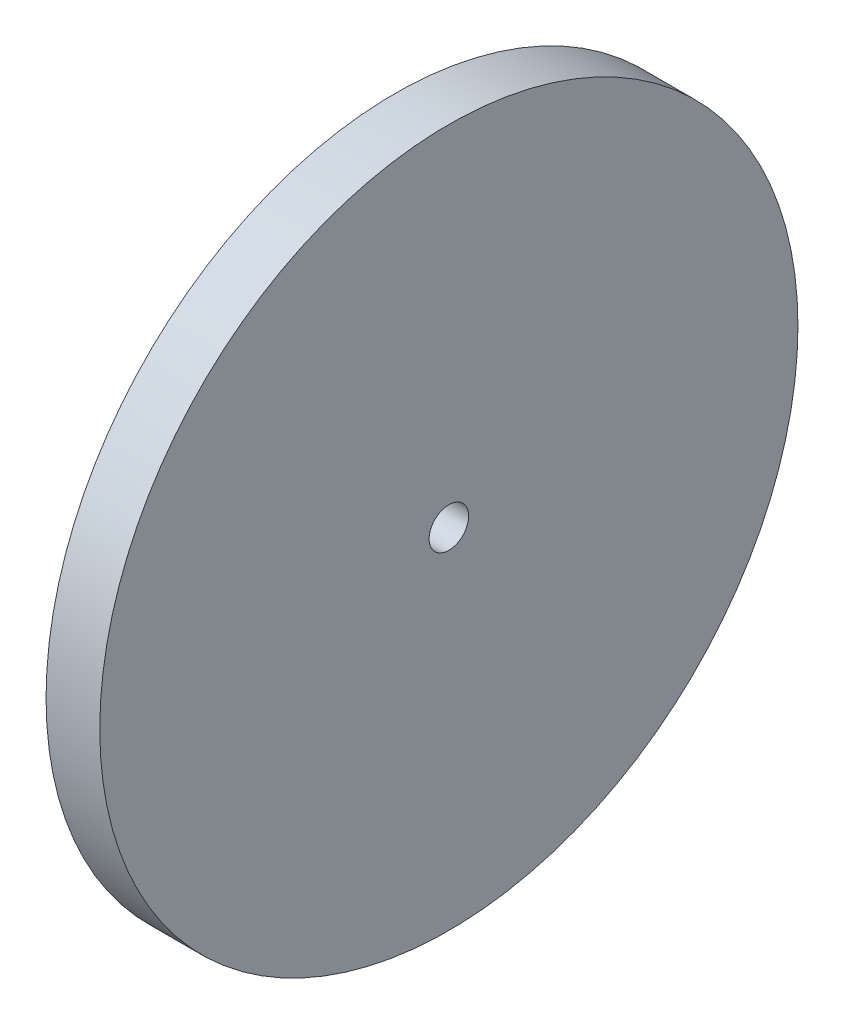
ISO-10303-21;
HEADER;
FILE_DESCRIPTION(('STEP AP214'),'2;1');
FILE_NAME('part.step','',(''),(''),'','','');
FILE_SCHEMA(('AUTOMOTIVE_DESIGN { 1 0 10303 214 1 1 1 1 }'));
ENDSEC;
DATA;
#1=APPLICATION_CONTEXT('core data for automotive mechanical design processes');
#2=APPLICATION_PROTOCOL_DEFINITION('international standard','automotive_design',2000,#1);
#3=PRODUCT_CONTEXT('',#1,'mechanical');
#4=PRODUCT('Part','Part','',(#3));
#5=PRODUCT_RELATED_PRODUCT_CATEGORY('part','',(#4));
#6=PRODUCT_DEFINITION_FORMATION('','',#4);
#7=PRODUCT_DEFINITION_CONTEXT('part definition',#1,'design');
#8=PRODUCT_DEFINITION('design','',#6,#7);
#9=PRODUCT_DEFINITION_SHAPE('','',#8);
#10=(LENGTH_UNIT() NAMED_UNIT(*) SI_UNIT(.MILLI.,.METRE.));
#11=(NAMED_UNIT(*) PLANE_ANGLE_UNIT() SI_UNIT($,.RADIAN.));
#12=(NAMED_UNIT(*) SI_UNIT($,.STERADIAN.) SOLID_ANGLE_UNIT());
#13=UNCERTAINTY_MEASURE_WITH_UNIT(LENGTH_MEASURE(1.E-05),#10,'distance_accuracy_value','');
#14=(GEOMETRIC_REPRESENTATION_CONTEXT(3) GLOBAL_UNCERTAINTY_ASSIGNED_CONTEXT((#13)) GLOBAL_UNIT_ASSIGNED_CONTEXT((#10,
#11,#12)) REPRESENTATION_CONTEXT('',''));
#15=CARTESIAN_POINT('',(0.,0.,0.));
#16=DIRECTION('',(0.,0.,1.));
#17=DIRECTION('',(1.,0.,0.));
#18=AXIS2_PLACEMENT_3D('',#15,#16,#17);
#19=CARTESIAN_POINT('',(10.,0.,0.));
#20=DIRECTION('',(1.,0.,0.));
#21=DIRECTION('',(0.,0.,-1.));
#22=AXIS2_PLACEMENT_3D('',#19,#20,#21);
#23=PLANE('',#22);
#24=CARTESIAN_POINT('',(10.,0.,0.));
#25=DIRECTION('',(1.,0.,0.));
#26=DIRECTION('',(0.,0.,-1.));
#27=AXIS2_PLACEMENT_3D('',#24,#25,#26);
#28=CIRCLE('',#27,65.);
#29=CARTESIAN_POINT('',(10.,0.,-65.));
#30=VERTEX_POINT('',#29);
#31=EDGE_CURVE('E10',#30,#30,#28,.T.);
#32=ORIENTED_EDGE('',*,*,#31,.T.);
#33=EDGE_LOOP('',(#32));
#34=FACE_BOUND('',#33,.T.);
#35=CARTESIAN_POINT('',(10.,0.,0.));
#36=DIRECTION('',(1.,0.,0.));
#37=DIRECTION('',(0.,0.,-1.));
#38=AXIS2_PLACEMENT_3D('',#35,#36,#37);
#39=CIRCLE('',#38,3.675);
#40=CARTESIAN_POINT('',(10.,0.,-3.675));
#41=VERTEX_POINT('',#40);
#42=EDGE_CURVE('E56',#41,#41,#39,.T.);
#43=ORIENTED_EDGE('',*,*,#42,.F.);
#44=EDGE_LOOP('',(#43));
#45=FACE_BOUND('',#44,.T.);
#46=ADVANCED_FACE('F43',(#34,#45),#23,.T.);
#47=CARTESIAN_POINT('',(0.,0.,0.));
#48=DIRECTION('',(1.,0.,0.));
#49=DIRECTION('',(0.,0.,-1.));
#50=AXIS2_PLACEMENT_3D('',#47,#48,#49);
#51=PLANE('',#50);
#52=CARTESIAN_POINT('',(0.,0.,0.));
#53=DIRECTION('',(1.,0.,0.));
#54=DIRECTION('',(0.,0.,-1.));
#55=AXIS2_PLACEMENT_3D('',#52,#53,#54);
#56=CIRCLE('',#55,65.);
#57=CARTESIAN_POINT('',(0.,0.,-65.));
#58=VERTEX_POINT('',#57);
#59=EDGE_CURVE('E47',#58,#58,#56,.T.);
#60=ORIENTED_EDGE('',*,*,#59,.F.);
#61=EDGE_LOOP('',(#60));
#62=FACE_BOUND('',#61,.T.);
#63=CARTESIAN_POINT('',(0.,0.,0.));
#64=DIRECTION('',(1.,0.,0.));
#65=DIRECTION('',(0.,0.,-1.));
#66=AXIS2_PLACEMENT_3D('',#63,#64,#65);
#67=CIRCLE('',#66,3.675);
#68=CARTESIAN_POINT('',(0.,0.,-3.675));
#69=VERTEX_POINT('',#68);
#70=EDGE_CURVE('E58',#69,#69,#67,.T.);
#71=ORIENTED_EDGE('',*,*,#70,.T.);
#72=EDGE_LOOP('',(#71));
#73=FACE_BOUND('',#72,.T.);
#74=ADVANCED_FACE('F70',(#62,#73),#51,.F.);
#75=CARTESIAN_POINT('',(10.,0.,0.));
#76=DIRECTION('',(-1.,0.,0.));
#77=DIRECTION('',(0.,0.,1.));
#78=AXIS2_PLACEMENT_3D('',#75,#76,#77);
#79=CYLINDRICAL_SURFACE('',#78,65.);
#80=ORIENTED_EDGE('',*,*,#31,.F.);
#81=EDGE_LOOP('',(#80));
#82=FACE_BOUND('',#81,.T.);
#83=ORIENTED_EDGE('',*,*,#59,.T.);
#84=EDGE_LOOP('',(#83));
#85=FACE_BOUND('',#84,.T.);
#86=ADVANCED_FACE('F45',(#82,#85),#79,.T.);
#87=CARTESIAN_POINT('',(10.,0.,0.));
#88=DIRECTION('',(-1.,0.,0.));
#89=DIRECTION('',(0.,0.,1.));
#90=AXIS2_PLACEMENT_3D('',#87,#88,#89);
#91=CYLINDRICAL_SURFACE('',#90,3.675);
#92=ORIENTED_EDGE('',*,*,#42,.T.);
#93=EDGE_LOOP('',(#92));
#94=FACE_BOUND('',#93,.T.);
#95=ORIENTED_EDGE('',*,*,#70,.F.);
#96=EDGE_LOOP('',(#95));
#97=FACE_BOUND('',#96,.T.);
#98=ADVANCED_FACE('F66',(#94,#97),#91,.F.);
#99=CLOSED_SHELL('',(#46,#74,#86,#98));
#100=MANIFOLD_SOLID_BREP('B2',#99);
#101=ADVANCED_BREP_SHAPE_REPRESENTATION('',(#18,#100),#14);
#102=SHAPE_DEFINITION_REPRESENTATION(#9,#101);
ENDSEC;
END-ISO-10303-21;
